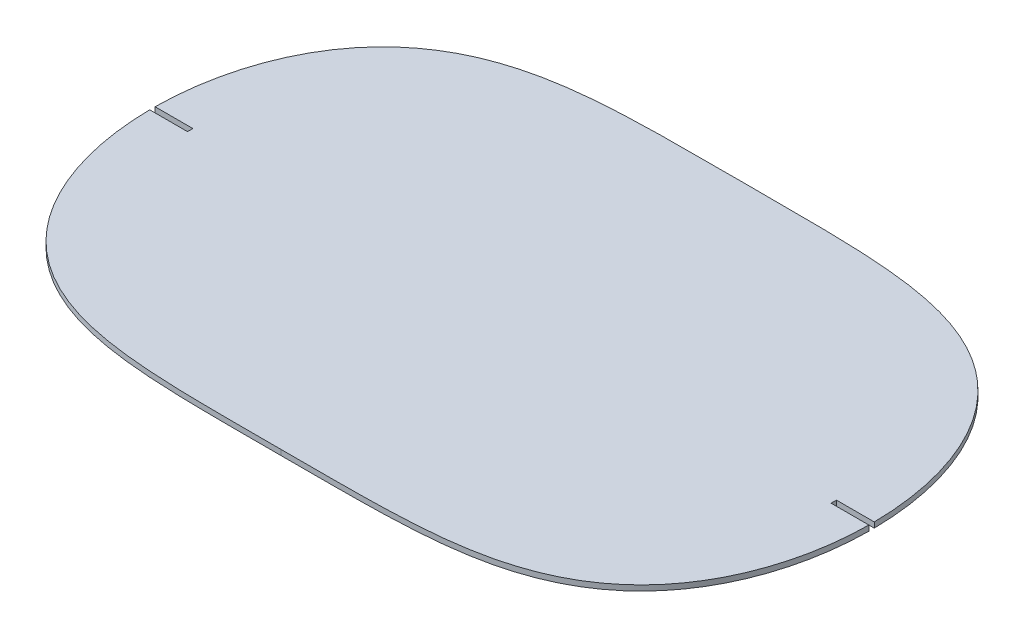
ISO-10303-21;
HEADER;
FILE_DESCRIPTION(('STEP AP214'),'2;1');
FILE_NAME('part.step','',(''),(''),'','','');
FILE_SCHEMA(('AUTOMOTIVE_DESIGN { 1 0 10303 214 1 1 1 1 }'));
ENDSEC;
DATA;
#1=APPLICATION_CONTEXT('core data for automotive mechanical design processes');
#2=APPLICATION_PROTOCOL_DEFINITION('international standard','automotive_design',2000,#1);
#3=PRODUCT_CONTEXT('',#1,'mechanical');
#4=PRODUCT('Part','Part','',(#3));
#5=PRODUCT_RELATED_PRODUCT_CATEGORY('part','',(#4));
#6=PRODUCT_DEFINITION_FORMATION('','',#4);
#7=PRODUCT_DEFINITION_CONTEXT('part definition',#1,'design');
#8=PRODUCT_DEFINITION('design','',#6,#7);
#9=PRODUCT_DEFINITION_SHAPE('','',#8);
#10=(LENGTH_UNIT() NAMED_UNIT(*) SI_UNIT(.MILLI.,.METRE.));
#11=(NAMED_UNIT(*) PLANE_ANGLE_UNIT() SI_UNIT($,.RADIAN.));
#12=(NAMED_UNIT(*) SI_UNIT($,.STERADIAN.) SOLID_ANGLE_UNIT());
#13=UNCERTAINTY_MEASURE_WITH_UNIT(LENGTH_MEASURE(1.E-05),#10,'distance_accuracy_value','');
#14=(GEOMETRIC_REPRESENTATION_CONTEXT(3) GLOBAL_UNCERTAINTY_ASSIGNED_CONTEXT((#13)) GLOBAL_UNIT_ASSIGNED_CONTEXT((#10,
#11,#12)) REPRESENTATION_CONTEXT('',''));
#15=CARTESIAN_POINT('',(0.,0.,0.));
#16=DIRECTION('',(0.,0.,1.));
#17=DIRECTION('',(1.,0.,0.));
#18=AXIS2_PLACEMENT_3D('',#15,#16,#17);
#19=CARTESIAN_POINT('',(200.857105825014,3.,5.64911515401343E-06));
#20=DIRECTION('',(0.,1.,0.));
#21=DIRECTION('',(0.,0.,1.));
#22=AXIS2_PLACEMENT_3D('',#19,#20,#21);
#23=PLANE('',#22);
#24=DIRECTION('',(0.,0.,-1.));
#25=VECTOR('',#24,1.);
#26=CARTESIAN_POINT('',(179.730545825011,3.,5.64911515401343E-06));
#27=LINE('',#26,#25);
#28=CARTESIAN_POINT('',(179.730545825011,3.,1.5));
#29=VERTEX_POINT('',#28);
#30=CARTESIAN_POINT('',(179.730545825011,3.,-1.5));
#31=VERTEX_POINT('',#30);
#32=EDGE_CURVE('E156',#29,#31,#27,.T.);
#33=ORIENTED_EDGE('',*,*,#32,.T.);
#34=DIRECTION('',(1.,0.,0.));
#35=VECTOR('',#34,1.);
#36=CARTESIAN_POINT('',(200.857105825014,3.,-1.5));
#37=LINE('',#36,#35);
#38=CARTESIAN_POINT('',(200.850325648475,3.,-1.50000000000002));
#39=VERTEX_POINT('',#38);
#40=EDGE_CURVE('E125',#31,#39,#37,.T.);
#41=ORIENTED_EDGE('',*,*,#40,.T.);
#42=CARTESIAN_POINT('',(0.,3.,-129.099444873581));
#43=CARTESIAN_POINT('',(4.32982571616229,3.,-129.099856757114));
#44=CARTESIAN_POINT('',(12.9894770343744,3.,-129.099521717198));
#45=CARTESIAN_POINT('',(25.9763012050508,3.,-129.099245614524));
#46=CARTESIAN_POINT('',(43.2902496761059,3.,-129.013980378849));
#47=CARTESIAN_POINT('',(60.600663959375,3.,-128.671189086577));
#48=CARTESIAN_POINT('',(77.8946557350061,3.,-127.812916551379));
#49=CARTESIAN_POINT('',(95.5430379767453,3.,-126.045988358331));
#50=CARTESIAN_POINT('',(113.013993350206,3.,-122.896019951878));
#51=CARTESIAN_POINT('',(130.046357945792,3.,-117.797143556373));
#52=CARTESIAN_POINT('',(146.158139311102,3.,-110.226946456887));
#53=CARTESIAN_POINT('',(160.431314667274,3.,-100.265018203375));
#54=CARTESIAN_POINT('',(172.693338202098,3.,-87.9118855405119));
#55=CARTESIAN_POINT('',(182.663351285006,3.,-73.6634230268386));
#56=CARTESIAN_POINT('',(190.340438043023,3.,-58.0791079962972));
#57=CARTESIAN_POINT('',(195.865426103116,3.,-41.6227202096997));
#58=CARTESIAN_POINT('',(199.400795758937,3.,-24.6361859087933));
#59=CARTESIAN_POINT('',(201.069948812253,3.,-7.37068611072047));
#60=CARTESIAN_POINT('',(200.93516658878,3.,9.97352573511911));
#61=CARTESIAN_POINT('',(198.991239132137,3.,27.2107186579236));
#62=CARTESIAN_POINT('',(195.166319776255,3.,44.1354287693462));
#63=CARTESIAN_POINT('',(189.328734448432,3.,60.4853847800454));
#64=CARTESIAN_POINT('',(181.314677981936,3.,75.9018024026227));
#65=CARTESIAN_POINT('',(170.994375318069,3.,89.9023366203162));
#66=CARTESIAN_POINT('',(157.86618948124,3.,102.437720293594));
#67=CARTESIAN_POINT('',(141.967900723941,3.,112.682947789741));
#68=CARTESIAN_POINT('',(124.642016349103,3.,119.756709815121));
#69=CARTESIAN_POINT('',(106.70837789649,3.,124.219228333159));
#70=CARTESIAN_POINT('',(88.446200883775,3.,126.903428265448));
#71=CARTESIAN_POINT('',(70.0513102843853,3.,128.322663006706));
#72=CARTESIAN_POINT('',(45.6297505598205,3.,129.099776242739));
#73=CARTESIAN_POINT('',(25.3490696609099,3.,129.099346892949));
#74=CARTESIAN_POINT('',(10.1399335313702,3.,129.099445048164));
#75=CARTESIAN_POINT('',(-2.22276026271484E-06,3.,129.099444873581));
#76=B_SPLINE_CURVE_WITH_KNOTS('',4,(#42,#43,#44,#45,#46,#47,#48,#49,#50,#51,#52,#53,#54,#55,#56,
#57,#58,#59,#60,#61,#62,#63,#64,#65,#66,#67,#68,#69,#70,#71,#72,#73,#74,#75),.UNSPECIFIED.,.F.,
.F.,(5,1,1,1,1,1,1,1,1,1,1,1,1,1,1,1,1,1,1,1,1,1,1,1,1,1,1,1,1,1,5),(0.,0.0312202303923898,
0.0624404607847796,0.093641546847734,0.124842632910688,0.156052703180765,0.187262773450843,
0.221451125056445,0.252661673578986,0.283871787990767,0.31508190664952,0.346292159915286,
0.377502474429577,0.408712793138054,0.43992312765303,0.471133499049255,0.502343874059166,
0.533554233074974,0.564764591007868,0.595974956916066,0.627185296278113,0.658395569461071,
0.689605837886848,0.720816286096547,0.757370801977376,0.793925658033159,0.823852076996093,
0.853778495959028,0.890332223211289,0.92688595046355,1.),.UNSPECIFIED.);
#77=CARTESIAN_POINT('',(0.,3.,-129.099444873581));
#78=VERTEX_POINT('',#77);
#79=EDGE_CURVE('E189',#78,#39,#76,.T.);
#80=ORIENTED_EDGE('',*,*,#79,.F.);
#81=CARTESIAN_POINT('',(0.,3.,-129.099444873581));
#82=CARTESIAN_POINT('',(-4.32982571615518,3.,-129.099856831662));
#83=CARTESIAN_POINT('',(-12.9894770343731,3.,-129.099521940843));
#84=CARTESIAN_POINT('',(-25.9763012050542,3.,-129.099246061769));
#85=CARTESIAN_POINT('',(-43.2902496775773,3.,-129.013981124196));
#86=CARTESIAN_POINT('',(-60.6006639667485,3.,-128.671190129965));
#87=CARTESIAN_POINT('',(-77.8946557571568,3.,-127.812917892525));
#88=CARTESIAN_POINT('',(-95.5430380293179,3.,-126.045990003336));
#89=CARTESIAN_POINT('',(-113.013993457013,3.,-122.896021897688));
#90=CARTESIAN_POINT('',(-130.046358140388,3.,-117.797145795436));
#91=CARTESIAN_POINT('',(-146.158139636038,3.,-110.226948973354));
#92=CARTESIAN_POINT('',(-160.431315163728,3.,-100.26502096559));
#93=CARTESIAN_POINT('',(-172.693338911242,3.,-87.9118885138469));
#94=CARTESIAN_POINT('',(-182.663352239471,3.,-73.6634261718315));
#95=CARTESIAN_POINT('',(-190.34043926581,3.,-58.0791112734698));
#96=CARTESIAN_POINT('',(-195.86542760924,3.,-41.6227235819984));
#97=CARTESIAN_POINT('',(-199.400797557526,3.,-24.636189341962));
#98=CARTESIAN_POINT('',(-201.069950908109,3.,-7.37068957262767));
#99=CARTESIAN_POINT('',(-200.935168983259,3.,9.97352227553251));
#100=CARTESIAN_POINT('',(-198.991241823396,3.,27.2107152318064));
#101=CARTESIAN_POINT('',(-195.166322758914,3.,44.1354254090843));
#102=CARTESIAN_POINT('',(-189.328737712595,3.,60.4853815202917));
#103=CARTESIAN_POINT('',(-181.31468151153,3.,75.9017992808504));
#104=CARTESIAN_POINT('',(-170.994379088716,3.,89.902333676233));
#105=CARTESIAN_POINT('',(-157.866193467714,3.,102.437717575544));
#106=CARTESIAN_POINT('',(-141.967904886812,3.,112.682945345419));
#107=CARTESIAN_POINT('',(-124.642020633765,3.,119.756707669106));
#108=CARTESIAN_POINT('',(-106.708382257985,3.,124.219226495915));
#109=CARTESIAN_POINT('',(-88.4462052914858,3.,126.903426742632));
#110=CARTESIAN_POINT('',(-70.0513147165316,3.,128.322661800602));
#111=CARTESIAN_POINT('',(-45.6297550053467,3.,129.099775457112));
#112=CARTESIAN_POINT('',(-25.3490741064288,3.,129.099346456504));
#113=CARTESIAN_POINT('',(-10.1399379768907,3.,129.099444873581));
#114=CARTESIAN_POINT('',(-2.22276026271484E-06,3.,129.099444873581));
#115=B_SPLINE_CURVE_WITH_KNOTS('',4,(#81,#82,#83,#84,#85,#86,#87,#88,#89,#90,#91,#92,#93,#94,
#95,#96,#97,#98,#99,#100,#101,#102,#103,#104,#105,#106,#107,#108,#109,#110,#111,#112,#113,#114),
.UNSPECIFIED.,.F.,.F.,(5,1,1,1,1,1,1,1,1,1,1,1,1,1,1,1,1,1,1,1,1,1,1,1,1,1,1,1,1,1,5),(0.,
0.0312202303923898,0.0624404607847796,0.093641546847734,0.124842632910688,0.156052703180765,
0.187262773450843,0.221451125056445,0.252661673578986,0.283871787990767,0.31508190664952,
0.346292159915286,0.377502474429577,0.408712793138054,0.43992312765303,0.471133499049255,
0.502343874059166,0.533554233074974,0.564764591007868,0.595974956916066,0.627185296278113,
0.658395569461071,0.689605837886848,0.720816286096547,0.757370801977376,0.793925658033159,
0.823852076996093,0.853778495959028,0.890332223211289,0.92688595046355,1.),.UNSPECIFIED.);
#116=CARTESIAN_POINT('',(-200.850327876671,3.,-1.5));
#117=VERTEX_POINT('',#116);
#118=EDGE_CURVE('E198',#78,#117,#115,.T.);
#119=ORIENTED_EDGE('',*,*,#118,.T.);
#120=DIRECTION('',(1.,0.,0.));
#121=VECTOR('',#120,1.);
#122=CARTESIAN_POINT('',(200.857105825014,3.,-1.5));
#123=LINE('',#122,#121);
#124=CARTESIAN_POINT('',(-179.730548047773,3.,-1.5));
#125=VERTEX_POINT('',#124);
#126=EDGE_CURVE('E178',#117,#125,#123,.T.);
#127=ORIENTED_EDGE('',*,*,#126,.T.);
#128=DIRECTION('',(0.,0.,1.));
#129=VECTOR('',#128,1.);
#130=CARTESIAN_POINT('',(-179.730548047773,3.,5.64911515401343E-06));
#131=LINE('',#130,#129);
#132=CARTESIAN_POINT('',(-179.730548047773,3.,1.5));
#133=VERTEX_POINT('',#132);
#134=EDGE_CURVE('E185',#125,#133,#131,.T.);
#135=ORIENTED_EDGE('',*,*,#134,.T.);
#136=DIRECTION('',(-1.,0.,0.));
#137=VECTOR('',#136,1.);
#138=CARTESIAN_POINT('',(200.857105825014,3.,1.5));
#139=LINE('',#138,#137);
#140=CARTESIAN_POINT('',(-200.850329483075,3.,1.5));
#141=VERTEX_POINT('',#140);
#142=EDGE_CURVE('E171',#133,#141,#139,.T.);
#143=ORIENTED_EDGE('',*,*,#142,.T.);
#144=CARTESIAN_POINT('',(-2.22276026271484E-06,3.,129.099444873581));
#145=VERTEX_POINT('',#144);
#146=EDGE_CURVE('E196',#141,#145,#115,.T.);
#147=ORIENTED_EDGE('',*,*,#146,.T.);
#148=CARTESIAN_POINT('',(200.850327265747,3.,1.50000000000003));
#149=VERTEX_POINT('',#148);
#150=EDGE_CURVE('E197',#149,#145,#76,.T.);
#151=ORIENTED_EDGE('',*,*,#150,.F.);
#152=DIRECTION('',(-1.,0.,0.));
#153=VECTOR('',#152,1.);
#154=CARTESIAN_POINT('',(200.857105825014,3.,1.5));
#155=LINE('',#154,#153);
#156=EDGE_CURVE('E56',#149,#29,#155,.T.);
#157=ORIENTED_EDGE('',*,*,#156,.T.);
#158=EDGE_LOOP('',(#33,#41,#80,#119,#127,#135,#143,#147,#151,#157));
#159=FACE_BOUND('',#158,.T.);
#160=ADVANCED_FACE('F39',(#159),#23,.T.);
#161=CARTESIAN_POINT('',(200.857105825014,0.,5.64911515401343E-06));
#162=DIRECTION('',(0.,1.,0.));
#163=DIRECTION('',(0.,0.,1.));
#164=AXIS2_PLACEMENT_3D('',#161,#162,#163);
#165=PLANE('',#164);
#166=DIRECTION('',(-1.,0.,0.));
#167=VECTOR('',#166,1.);
#168=CARTESIAN_POINT('',(179.730545825011,0.,-1.5));
#169=LINE('',#168,#167);
#170=CARTESIAN_POINT('',(200.850325648475,0.,-1.5));
#171=VERTEX_POINT('',#170);
#172=CARTESIAN_POINT('',(179.730545825011,0.,-1.5));
#173=VERTEX_POINT('',#172);
#174=EDGE_CURVE('E123',#171,#173,#169,.T.);
#175=ORIENTED_EDGE('',*,*,#174,.T.);
#176=DIRECTION('',(0.,0.,1.));
#177=VECTOR('',#176,1.);
#178=CARTESIAN_POINT('',(179.730545825011,0.,-1.5));
#179=LINE('',#178,#177);
#180=CARTESIAN_POINT('',(179.730545825011,0.,1.5));
#181=VERTEX_POINT('',#180);
#182=EDGE_CURVE('E132',#173,#181,#179,.T.);
#183=ORIENTED_EDGE('',*,*,#182,.T.);
#184=DIRECTION('',(1.,0.,0.));
#185=VECTOR('',#184,1.);
#186=CARTESIAN_POINT('',(179.730545825011,0.,1.5));
#187=LINE('',#186,#185);
#188=CARTESIAN_POINT('',(200.850327265747,0.,1.5));
#189=VERTEX_POINT('',#188);
#190=EDGE_CURVE('E138',#181,#189,#187,.T.);
#191=ORIENTED_EDGE('',*,*,#190,.T.);
#192=CARTESIAN_POINT('',(0.,0.,-129.099444873581));
#193=CARTESIAN_POINT('',(4.32982571616229,0.,-129.099856757114));
#194=CARTESIAN_POINT('',(12.9894770343744,0.,-129.099521717198));
#195=CARTESIAN_POINT('',(25.9763012050508,0.,-129.099245614524));
#196=CARTESIAN_POINT('',(43.2902496761059,0.,-129.013980378849));
#197=CARTESIAN_POINT('',(60.600663959375,0.,-128.671189086577));
#198=CARTESIAN_POINT('',(77.8946557350061,0.,-127.812916551379));
#199=CARTESIAN_POINT('',(95.5430379767453,0.,-126.045988358331));
#200=CARTESIAN_POINT('',(113.013993350206,0.,-122.896019951878));
#201=CARTESIAN_POINT('',(130.046357945792,0.,-117.797143556373));
#202=CARTESIAN_POINT('',(146.158139311102,0.,-110.226946456887));
#203=CARTESIAN_POINT('',(160.431314667274,0.,-100.265018203375));
#204=CARTESIAN_POINT('',(172.693338202098,0.,-87.9118855405119));
#205=CARTESIAN_POINT('',(182.663351285006,0.,-73.6634230268386));
#206=CARTESIAN_POINT('',(190.340438043023,0.,-58.0791079962972));
#207=CARTESIAN_POINT('',(195.865426103116,0.,-41.6227202096997));
#208=CARTESIAN_POINT('',(199.400795758937,0.,-24.6361859087933));
#209=CARTESIAN_POINT('',(201.069948812253,0.,-7.37068611072047));
#210=CARTESIAN_POINT('',(200.93516658878,0.,9.97352573511911));
#211=CARTESIAN_POINT('',(198.991239132137,0.,27.2107186579236));
#212=CARTESIAN_POINT('',(195.166319776255,0.,44.1354287693462));
#213=CARTESIAN_POINT('',(189.328734448432,0.,60.4853847800454));
#214=CARTESIAN_POINT('',(181.314677981936,0.,75.9018024026227));
#215=CARTESIAN_POINT('',(170.994375318069,0.,89.9023366203162));
#216=CARTESIAN_POINT('',(157.86618948124,0.,102.437720293594));
#217=CARTESIAN_POINT('',(141.967900723941,0.,112.682947789741));
#218=CARTESIAN_POINT('',(124.642016349103,0.,119.756709815121));
#219=CARTESIAN_POINT('',(106.70837789649,0.,124.219228333159));
#220=CARTESIAN_POINT('',(88.446200883775,0.,126.903428265448));
#221=CARTESIAN_POINT('',(70.0513102843853,0.,128.322663006706));
#222=CARTESIAN_POINT('',(45.6297505598205,0.,129.099776242739));
#223=CARTESIAN_POINT('',(25.3490696609099,0.,129.099346892949));
#224=CARTESIAN_POINT('',(10.1399335313702,0.,129.099445048164));
#225=CARTESIAN_POINT('',(-2.22276026271484E-06,0.,129.099444873581));
#226=B_SPLINE_CURVE_WITH_KNOTS('',4,(#192,#193,#194,#195,#196,#197,#198,#199,#200,#201,#202,
#203,#204,#205,#206,#207,#208,#209,#210,#211,#212,#213,#214,#215,#216,#217,#218,#219,#220,#221,
#222,#223,#224,#225),.UNSPECIFIED.,.F.,.F.,(5,1,1,1,1,1,1,1,1,1,1,1,1,1,1,1,1,1,1,1,1,1,1,1,1,1,
1,1,1,1,5),(0.,0.0312202303923898,0.0624404607847796,0.093641546847734,0.124842632910688,
0.156052703180765,0.187262773450843,0.221451125056445,0.252661673578986,0.283871787990767,
0.31508190664952,0.346292159915286,0.377502474429577,0.408712793138054,0.43992312765303,
0.471133499049255,0.502343874059166,0.533554233074974,0.564764591007868,0.595974956916066,
0.627185296278113,0.658395569461071,0.689605837886848,0.720816286096547,0.757370801977376,
0.793925658033159,0.823852076996093,0.853778495959028,0.890332223211289,0.92688595046355,1.),.UNSPECIFIED.);
#227=CARTESIAN_POINT('',(-2.22276026271484E-06,0.,129.099444873581));
#228=VERTEX_POINT('',#227);
#229=EDGE_CURVE('E188',#189,#228,#226,.T.);
#230=ORIENTED_EDGE('',*,*,#229,.T.);
#231=CARTESIAN_POINT('',(0.,0.,-129.099444873581));
#232=CARTESIAN_POINT('',(-4.32982571615518,0.,-129.099856831662));
#233=CARTESIAN_POINT('',(-12.9894770343731,0.,-129.099521940843));
#234=CARTESIAN_POINT('',(-25.9763012050542,0.,-129.099246061769));
#235=CARTESIAN_POINT('',(-43.2902496775773,0.,-129.013981124196));
#236=CARTESIAN_POINT('',(-60.6006639667485,0.,-128.671190129965));
#237=CARTESIAN_POINT('',(-77.8946557571568,0.,-127.812917892525));
#238=CARTESIAN_POINT('',(-95.5430380293179,0.,-126.045990003336));
#239=CARTESIAN_POINT('',(-113.013993457013,0.,-122.896021897688));
#240=CARTESIAN_POINT('',(-130.046358140388,0.,-117.797145795436));
#241=CARTESIAN_POINT('',(-146.158139636038,0.,-110.226948973354));
#242=CARTESIAN_POINT('',(-160.431315163728,0.,-100.26502096559));
#243=CARTESIAN_POINT('',(-172.693338911242,0.,-87.9118885138469));
#244=CARTESIAN_POINT('',(-182.663352239471,0.,-73.6634261718315));
#245=CARTESIAN_POINT('',(-190.34043926581,0.,-58.0791112734698));
#246=CARTESIAN_POINT('',(-195.86542760924,0.,-41.6227235819984));
#247=CARTESIAN_POINT('',(-199.400797557526,0.,-24.636189341962));
#248=CARTESIAN_POINT('',(-201.069950908109,0.,-7.37068957262767));
#249=CARTESIAN_POINT('',(-200.935168983259,0.,9.97352227553251));
#250=CARTESIAN_POINT('',(-198.991241823396,0.,27.2107152318064));
#251=CARTESIAN_POINT('',(-195.166322758914,0.,44.1354254090843));
#252=CARTESIAN_POINT('',(-189.328737712595,0.,60.4853815202917));
#253=CARTESIAN_POINT('',(-181.31468151153,0.,75.9017992808504));
#254=CARTESIAN_POINT('',(-170.994379088716,0.,89.902333676233));
#255=CARTESIAN_POINT('',(-157.866193467714,0.,102.437717575544));
#256=CARTESIAN_POINT('',(-141.967904886812,0.,112.682945345419));
#257=CARTESIAN_POINT('',(-124.642020633765,0.,119.756707669106));
#258=CARTESIAN_POINT('',(-106.708382257985,0.,124.219226495915));
#259=CARTESIAN_POINT('',(-88.4462052914858,0.,126.903426742632));
#260=CARTESIAN_POINT('',(-70.0513147165316,0.,128.322661800602));
#261=CARTESIAN_POINT('',(-45.6297550053467,0.,129.099775457112));
#262=CARTESIAN_POINT('',(-25.3490741064288,0.,129.099346456504));
#263=CARTESIAN_POINT('',(-10.1399379768907,0.,129.099444873581));
#264=CARTESIAN_POINT('',(-2.22276026271484E-06,0.,129.099444873581));
#265=B_SPLINE_CURVE_WITH_KNOTS('',4,(#231,#232,#233,#234,#235,#236,#237,#238,#239,#240,#241,
#242,#243,#244,#245,#246,#247,#248,#249,#250,#251,#252,#253,#254,#255,#256,#257,#258,#259,#260,
#261,#262,#263,#264),.UNSPECIFIED.,.F.,.F.,(5,1,1,1,1,1,1,1,1,1,1,1,1,1,1,1,1,1,1,1,1,1,1,1,1,1,
1,1,1,1,5),(0.,0.0312202303923898,0.0624404607847796,0.093641546847734,0.124842632910688,
0.156052703180765,0.187262773450843,0.221451125056445,0.252661673578986,0.283871787990767,
0.31508190664952,0.346292159915286,0.377502474429577,0.408712793138054,0.43992312765303,
0.471133499049255,0.502343874059166,0.533554233074974,0.564764591007868,0.595974956916066,
0.627185296278113,0.658395569461071,0.689605837886848,0.720816286096547,0.757370801977376,
0.793925658033159,0.823852076996093,0.853778495959028,0.890332223211289,0.92688595046355,1.),.UNSPECIFIED.);
#266=CARTESIAN_POINT('',(-200.850329483075,0.,1.5));
#267=VERTEX_POINT('',#266);
#268=EDGE_CURVE('E256',#267,#228,#265,.T.);
#269=ORIENTED_EDGE('',*,*,#268,.F.);
#270=DIRECTION('',(-1.,0.,0.));
#271=VECTOR('',#270,1.);
#272=CARTESIAN_POINT('',(200.857105825014,0.,1.5));
#273=LINE('',#272,#271);
#274=CARTESIAN_POINT('',(-179.730548047773,0.,1.5));
#275=VERTEX_POINT('',#274);
#276=EDGE_CURVE('E249',#275,#267,#273,.T.);
#277=ORIENTED_EDGE('',*,*,#276,.F.);
#278=DIRECTION('',(0.,0.,-1.));
#279=VECTOR('',#278,1.);
#280=CARTESIAN_POINT('',(-179.730548047773,0.,-1.5));
#281=LINE('',#280,#279);
#282=CARTESIAN_POINT('',(-179.730548047773,0.,-1.5));
#283=VERTEX_POINT('',#282);
#284=EDGE_CURVE('E64',#275,#283,#281,.T.);
#285=ORIENTED_EDGE('',*,*,#284,.T.);
#286=DIRECTION('',(-1.,0.,0.));
#287=VECTOR('',#286,1.);
#288=CARTESIAN_POINT('',(-179.730548047773,0.,-1.5));
#289=LINE('',#288,#287);
#290=CARTESIAN_POINT('',(-200.850327876671,0.,-1.5));
#291=VERTEX_POINT('',#290);
#292=EDGE_CURVE('E161',#283,#291,#289,.T.);
#293=ORIENTED_EDGE('',*,*,#292,.T.);
#294=CARTESIAN_POINT('',(0.,0.,-129.099444873581));
#295=VERTEX_POINT('',#294);
#296=EDGE_CURVE('E258',#295,#291,#265,.T.);
#297=ORIENTED_EDGE('',*,*,#296,.F.);
#298=EDGE_CURVE('E144',#295,#171,#226,.T.);
#299=ORIENTED_EDGE('',*,*,#298,.T.);
#300=EDGE_LOOP('',(#175,#183,#191,#230,#269,#277,#285,#293,#297,#299));
#301=FACE_BOUND('',#300,.T.);
#302=ADVANCED_FACE('F141',(#301),#165,.F.);
#303=DIRECTION('',(0.,-1.,0.));
#304=VECTOR('',#303,1.);
#305=SURFACE_OF_LINEAR_EXTRUSION('',#76,#304);
#306=ORIENTED_EDGE('',*,*,#79,.T.);
#307=DIRECTION('',(0.,-1.,0.));
#308=VECTOR('',#307,1.);
#309=CARTESIAN_POINT('',(200.850325648475,3.,-1.50000000000002));
#310=LINE('',#309,#308);
#311=EDGE_CURVE('E11',#39,#171,#310,.T.);
#312=ORIENTED_EDGE('',*,*,#311,.T.);
#313=ORIENTED_EDGE('',*,*,#298,.F.);
#314=DIRECTION('',(0.,-1.,0.));
#315=VECTOR('',#314,1.);
#316=CARTESIAN_POINT('',(0.,3.,-129.099444873581));
#317=LINE('',#316,#315);
#318=EDGE_CURVE('E266',#78,#295,#317,.T.);
#319=ORIENTED_EDGE('',*,*,#318,.F.);
#320=EDGE_LOOP('',(#306,#312,#313,#319));
#321=FACE_BOUND('',#320,.T.);
#322=ADVANCED_FACE('F41',(#321),#305,.T.);
#323=ORIENTED_EDGE('',*,*,#229,.F.);
#324=DIRECTION('',(0.,-1.,0.));
#325=VECTOR('',#324,1.);
#326=CARTESIAN_POINT('',(200.850327265747,3.,1.50000000000003));
#327=LINE('',#326,#325);
#328=EDGE_CURVE('E49',#189,#149,#327,.F.);
#329=ORIENTED_EDGE('',*,*,#328,.T.);
#330=ORIENTED_EDGE('',*,*,#150,.T.);
#331=DIRECTION('',(0.,-1.,0.));
#332=VECTOR('',#331,1.);
#333=CARTESIAN_POINT('',(-2.22276026271484E-06,3.,129.099444873581));
#334=LINE('',#333,#332);
#335=EDGE_CURVE('E208',#145,#228,#334,.T.);
#336=ORIENTED_EDGE('',*,*,#335,.T.);
#337=EDGE_LOOP('',(#323,#329,#330,#336));
#338=FACE_BOUND('',#337,.T.);
#339=ADVANCED_FACE('F219',(#338),#305,.T.);
#340=DIRECTION('',(0.,-1.,0.));
#341=VECTOR('',#340,1.);
#342=SURFACE_OF_LINEAR_EXTRUSION('',#115,#341);
#343=DIRECTION('',(0.,-1.,0.));
#344=VECTOR('',#343,1.);
#345=CARTESIAN_POINT('',(-200.850327876671,3.,-1.50000000000002));
#346=LINE('',#345,#344);
#347=EDGE_CURVE('E182',#117,#291,#346,.T.);
#348=ORIENTED_EDGE('',*,*,#347,.F.);
#349=ORIENTED_EDGE('',*,*,#118,.F.);
#350=ORIENTED_EDGE('',*,*,#318,.T.);
#351=ORIENTED_EDGE('',*,*,#296,.T.);
#352=EDGE_LOOP('',(#348,#349,#350,#351));
#353=FACE_BOUND('',#352,.T.);
#354=ADVANCED_FACE('F215',(#353),#342,.F.);
#355=DIRECTION('',(0.,-1.,0.));
#356=VECTOR('',#355,1.);
#357=CARTESIAN_POINT('',(-200.850329483075,3.,1.49999999999997));
#358=LINE('',#357,#356);
#359=EDGE_CURVE('E175',#267,#141,#358,.F.);
#360=ORIENTED_EDGE('',*,*,#359,.F.);
#361=ORIENTED_EDGE('',*,*,#268,.T.);
#362=ORIENTED_EDGE('',*,*,#335,.F.);
#363=ORIENTED_EDGE('',*,*,#146,.F.);
#364=EDGE_LOOP('',(#360,#361,#362,#363));
#365=FACE_BOUND('',#364,.T.);
#366=ADVANCED_FACE('F218',(#365),#342,.F.);
#367=CARTESIAN_POINT('',(-179.730548047773,98.,-1.5));
#368=DIRECTION('',(0.,0.,1.));
#369=DIRECTION('',(1.,0.,0.));
#370=AXIS2_PLACEMENT_3D('',#367,#368,#369);
#371=PLANE('',#370);
#372=ORIENTED_EDGE('',*,*,#347,.T.);
#373=ORIENTED_EDGE('',*,*,#292,.F.);
#374=DIRECTION('',(0.,-1.,0.));
#375=VECTOR('',#374,1.);
#376=CARTESIAN_POINT('',(-179.730548047773,98.,-1.5));
#377=LINE('',#376,#375);
#378=EDGE_CURVE('E168',#125,#283,#377,.T.);
#379=ORIENTED_EDGE('',*,*,#378,.F.);
#380=ORIENTED_EDGE('',*,*,#126,.F.);
#381=EDGE_LOOP('',(#372,#373,#379,#380));
#382=FACE_BOUND('',#381,.T.);
#383=ADVANCED_FACE('F230',(#382),#371,.T.);
#384=CARTESIAN_POINT('',(-179.730548047773,98.,1.5));
#385=DIRECTION('',(0.,0.,-1.));
#386=DIRECTION('',(-1.,0.,0.));
#387=AXIS2_PLACEMENT_3D('',#384,#385,#386);
#388=PLANE('',#387);
#389=ORIENTED_EDGE('',*,*,#359,.T.);
#390=ORIENTED_EDGE('',*,*,#142,.F.);
#391=DIRECTION('',(0.,-1.,0.));
#392=VECTOR('',#391,1.);
#393=CARTESIAN_POINT('',(-179.730548047773,98.,1.5));
#394=LINE('',#393,#392);
#395=EDGE_CURVE('E165',#133,#275,#394,.T.);
#396=ORIENTED_EDGE('',*,*,#395,.T.);
#397=ORIENTED_EDGE('',*,*,#276,.T.);
#398=EDGE_LOOP('',(#389,#390,#396,#397));
#399=FACE_BOUND('',#398,.T.);
#400=ADVANCED_FACE('F229',(#399),#388,.T.);
#401=CARTESIAN_POINT('',(-179.730548047773,98.,-1.5));
#402=DIRECTION('',(-1.,0.,0.));
#403=DIRECTION('',(0.,0.,1.));
#404=AXIS2_PLACEMENT_3D('',#401,#402,#403);
#405=PLANE('',#404);
#406=ORIENTED_EDGE('',*,*,#378,.T.);
#407=ORIENTED_EDGE('',*,*,#284,.F.);
#408=ORIENTED_EDGE('',*,*,#395,.F.);
#409=ORIENTED_EDGE('',*,*,#134,.F.);
#410=EDGE_LOOP('',(#406,#407,#408,#409));
#411=FACE_BOUND('',#410,.T.);
#412=ADVANCED_FACE('F226',(#411),#405,.T.);
#413=CARTESIAN_POINT('',(179.730545825011,39.,-1.5));
#414=DIRECTION('',(0.,0.,1.));
#415=DIRECTION('',(1.,0.,0.));
#416=AXIS2_PLACEMENT_3D('',#413,#414,#415);
#417=PLANE('',#416);
#418=DIRECTION('',(0.,-1.,0.));
#419=VECTOR('',#418,1.);
#420=CARTESIAN_POINT('',(179.730545825011,39.,-1.5));
#421=LINE('',#420,#419);
#422=EDGE_CURVE('E119',#31,#173,#421,.T.);
#423=ORIENTED_EDGE('',*,*,#422,.T.);
#424=ORIENTED_EDGE('',*,*,#174,.F.);
#425=ORIENTED_EDGE('',*,*,#311,.F.);
#426=ORIENTED_EDGE('',*,*,#40,.F.);
#427=EDGE_LOOP('',(#423,#424,#425,#426));
#428=FACE_BOUND('',#427,.T.);
#429=ADVANCED_FACE('F121',(#428),#417,.T.);
#430=CARTESIAN_POINT('',(179.730545825011,39.,-1.5));
#431=DIRECTION('',(1.,0.,0.));
#432=DIRECTION('',(0.,0.,-1.));
#433=AXIS2_PLACEMENT_3D('',#430,#431,#432);
#434=PLANE('',#433);
#435=DIRECTION('',(0.,-1.,0.));
#436=VECTOR('',#435,1.);
#437=CARTESIAN_POINT('',(179.730545825011,39.,1.5));
#438=LINE('',#437,#436);
#439=EDGE_CURVE('E129',#29,#181,#438,.T.);
#440=ORIENTED_EDGE('',*,*,#439,.T.);
#441=ORIENTED_EDGE('',*,*,#182,.F.);
#442=ORIENTED_EDGE('',*,*,#422,.F.);
#443=ORIENTED_EDGE('',*,*,#32,.F.);
#444=EDGE_LOOP('',(#440,#441,#442,#443));
#445=FACE_BOUND('',#444,.T.);
#446=ADVANCED_FACE('F133',(#445),#434,.T.);
#447=CARTESIAN_POINT('',(179.730545825011,39.,1.5));
#448=DIRECTION('',(0.,0.,-1.));
#449=DIRECTION('',(-1.,0.,0.));
#450=AXIS2_PLACEMENT_3D('',#447,#448,#449);
#451=PLANE('',#450);
#452=ORIENTED_EDGE('',*,*,#328,.F.);
#453=ORIENTED_EDGE('',*,*,#190,.F.);
#454=ORIENTED_EDGE('',*,*,#439,.F.);
#455=ORIENTED_EDGE('',*,*,#156,.F.);
#456=EDGE_LOOP('',(#452,#453,#454,#455));
#457=FACE_BOUND('',#456,.T.);
#458=ADVANCED_FACE('F241',(#457),#451,.T.);
#459=CLOSED_SHELL('',(#160,#302,#322,#339,#354,#366,#383,#400,#412,#429,#446,#458));
#460=MANIFOLD_SOLID_BREP('B2',#459);
#461=ADVANCED_BREP_SHAPE_REPRESENTATION('',(#18,#460),#14);
#462=SHAPE_DEFINITION_REPRESENTATION(#9,#461);
ENDSEC;
END-ISO-10303-21;
